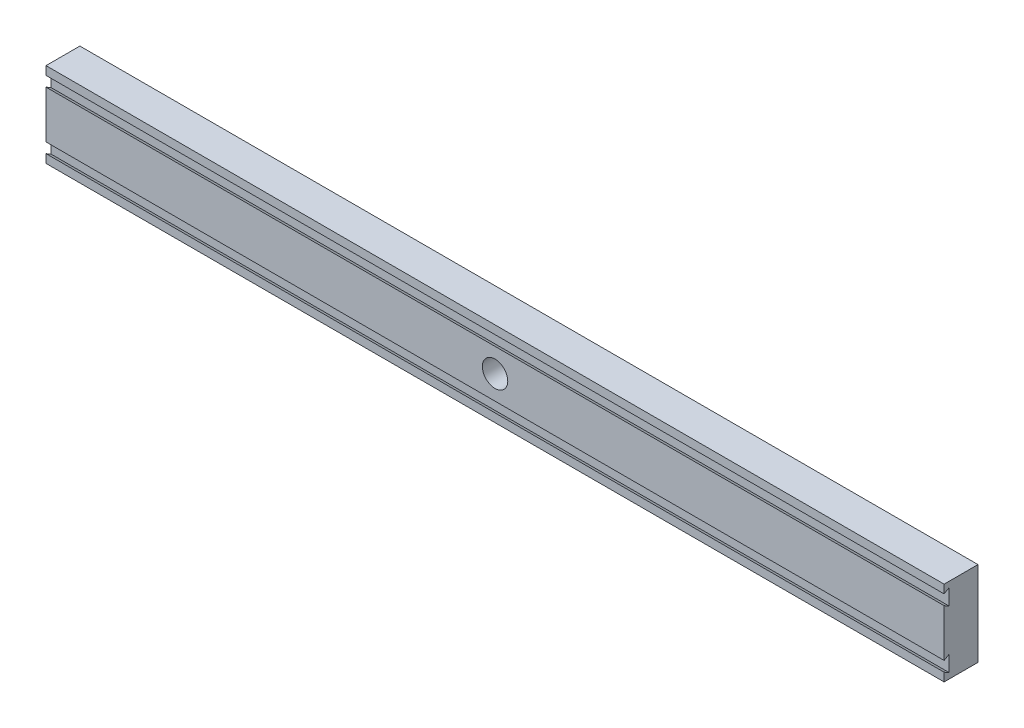
ISO-10303-21;
HEADER;
FILE_DESCRIPTION(('STEP AP214'),'2;1');
FILE_NAME('part.step','',(''),(''),'','','');
FILE_SCHEMA(('AUTOMOTIVE_DESIGN { 1 0 10303 214 1 1 1 1 }'));
ENDSEC;
DATA;
#1=APPLICATION_CONTEXT('core data for automotive mechanical design processes');
#2=APPLICATION_PROTOCOL_DEFINITION('international standard','automotive_design',2000,#1);
#3=PRODUCT_CONTEXT('',#1,'mechanical');
#4=PRODUCT('Part','Part','',(#3));
#5=PRODUCT_RELATED_PRODUCT_CATEGORY('part','',(#4));
#6=PRODUCT_DEFINITION_FORMATION('','',#4);
#7=PRODUCT_DEFINITION_CONTEXT('part definition',#1,'design');
#8=PRODUCT_DEFINITION('design','',#6,#7);
#9=PRODUCT_DEFINITION_SHAPE('','',#8);
#10=(LENGTH_UNIT() NAMED_UNIT(*) SI_UNIT(.MILLI.,.METRE.));
#11=(NAMED_UNIT(*) PLANE_ANGLE_UNIT() SI_UNIT($,.RADIAN.));
#12=(NAMED_UNIT(*) SI_UNIT($,.STERADIAN.) SOLID_ANGLE_UNIT());
#13=UNCERTAINTY_MEASURE_WITH_UNIT(LENGTH_MEASURE(1.E-05),#10,'distance_accuracy_value','');
#14=(GEOMETRIC_REPRESENTATION_CONTEXT(3) GLOBAL_UNCERTAINTY_ASSIGNED_CONTEXT((#13)) GLOBAL_UNIT_ASSIGNED_CONTEXT((#10,
#11,#12)) REPRESENTATION_CONTEXT('',''));
#15=CARTESIAN_POINT('',(0.,0.,0.));
#16=DIRECTION('',(0.,0.,1.));
#17=DIRECTION('',(1.,0.,0.));
#18=AXIS2_PLACEMENT_3D('',#15,#16,#17);
#19=CARTESIAN_POINT('',(66.25,-4.83253175473053,2.48185594676636));
#20=DIRECTION('',(0.,0.866025403784436,-0.500000000000004));
#21=DIRECTION('',(0.,0.500000000000004,0.866025403784436));
#22=AXIS2_PLACEMENT_3D('',#19,#20,#21);
#23=PLANE('',#22);
#24=DIRECTION('',(0.,-0.500000000000005,-0.866025403784436));
#25=VECTOR('',#24,1.);
#26=CARTESIAN_POINT('',(-66.25,-4.83253175473053,2.48185594676636));
#27=LINE('',#26,#25);
#28=CARTESIAN_POINT('',(-66.25,-5.,2.19179243730524));
#29=VERTEX_POINT('',#28);
#30=CARTESIAN_POINT('',(-66.25,-5.43301270189222,1.44179243730524));
#31=VERTEX_POINT('',#30);
#32=EDGE_CURVE('E175',#29,#31,#27,.T.);
#33=ORIENTED_EDGE('',*,*,#32,.F.);
#34=DIRECTION('',(-1.,0.,0.));
#35=VECTOR('',#34,1.);
#36=CARTESIAN_POINT('',(66.25,-5.,2.19179243730524));
#37=LINE('',#36,#35);
#38=CARTESIAN_POINT('',(66.25,-5.,2.19179243730524));
#39=VERTEX_POINT('',#38);
#40=EDGE_CURVE('E12',#39,#29,#37,.T.);
#41=ORIENTED_EDGE('',*,*,#40,.F.);
#42=DIRECTION('',(0.,-0.500000000000005,-0.866025403784436));
#43=VECTOR('',#42,1.);
#44=CARTESIAN_POINT('',(66.25,-4.83253175473053,2.48185594676636));
#45=LINE('',#44,#43);
#46=CARTESIAN_POINT('',(66.25,-5.43301270189222,1.44179243730524));
#47=VERTEX_POINT('',#46);
#48=EDGE_CURVE('E207',#39,#47,#45,.T.);
#49=ORIENTED_EDGE('',*,*,#48,.T.);
#50=DIRECTION('',(-1.,0.,0.));
#51=VECTOR('',#50,1.);
#52=CARTESIAN_POINT('',(66.25,-5.43301270189222,1.44179243730524));
#53=LINE('',#52,#51);
#54=EDGE_CURVE('E62',#47,#31,#53,.T.);
#55=ORIENTED_EDGE('',*,*,#54,.T.);
#56=EDGE_LOOP('',(#33,#41,#49,#55));
#57=FACE_BOUND('',#56,.T.);
#58=ADVANCED_FACE('F48',(#57),#23,.T.);
#59=CARTESIAN_POINT('',(66.25,0.,2.19179243730524));
#60=DIRECTION('',(0.,0.,1.));
#61=DIRECTION('',(1.,0.,0.));
#62=AXIS2_PLACEMENT_3D('',#59,#60,#61);
#63=PLANE('',#62);
#64=DIRECTION('',(0.,1.,0.));
#65=VECTOR('',#64,1.);
#66=CARTESIAN_POINT('',(-66.25,0.,2.19179243730524));
#67=LINE('',#66,#65);
#68=CARTESIAN_POINT('',(-66.25,-6.25,2.19179243730524));
#69=VERTEX_POINT('',#68);
#70=EDGE_CURVE('E172',#69,#29,#67,.T.);
#71=ORIENTED_EDGE('',*,*,#70,.F.);
#72=DIRECTION('',(-1.,0.,0.));
#73=VECTOR('',#72,1.);
#74=CARTESIAN_POINT('',(66.25,-6.25,2.19179243730524));
#75=LINE('',#74,#73);
#76=CARTESIAN_POINT('',(66.25,-6.25,2.19179243730524));
#77=VERTEX_POINT('',#76);
#78=EDGE_CURVE('E60',#77,#69,#75,.T.);
#79=ORIENTED_EDGE('',*,*,#78,.F.);
#80=DIRECTION('',(0.,1.,0.));
#81=VECTOR('',#80,1.);
#82=CARTESIAN_POINT('',(66.25,0.,2.19179243730524));
#83=LINE('',#82,#81);
#84=EDGE_CURVE('E165',#77,#39,#83,.T.);
#85=ORIENTED_EDGE('',*,*,#84,.T.);
#86=ORIENTED_EDGE('',*,*,#40,.T.);
#87=EDGE_LOOP('',(#71,#79,#85,#86));
#88=FACE_BOUND('',#87,.T.);
#89=ADVANCED_FACE('F248',(#88),#63,.T.);
#90=CARTESIAN_POINT('',(66.25,-6.25,-0.308207562694763));
#91=DIRECTION('',(0.,1.,0.));
#92=DIRECTION('',(0.,0.,1.));
#93=AXIS2_PLACEMENT_3D('',#90,#91,#92);
#94=PLANE('',#93);
#95=DIRECTION('',(0.,0.,-1.));
#96=VECTOR('',#95,1.);
#97=CARTESIAN_POINT('',(-66.25,-6.25,-0.308207562694763));
#98=LINE('',#97,#96);
#99=CARTESIAN_POINT('',(-66.25,-6.25,-2.80820756269476));
#100=VERTEX_POINT('',#99);
#101=EDGE_CURVE('E178',#69,#100,#98,.T.);
#102=ORIENTED_EDGE('',*,*,#101,.T.);
#103=DIRECTION('',(-1.,0.,0.));
#104=VECTOR('',#103,1.);
#105=CARTESIAN_POINT('',(66.25,-6.25,-2.80820756269476));
#106=LINE('',#105,#104);
#107=CARTESIAN_POINT('',(66.25,-6.25,-2.80820756269476));
#108=VERTEX_POINT('',#107);
#109=EDGE_CURVE('E234',#108,#100,#106,.T.);
#110=ORIENTED_EDGE('',*,*,#109,.F.);
#111=DIRECTION('',(0.,0.,-1.));
#112=VECTOR('',#111,1.);
#113=CARTESIAN_POINT('',(66.25,-6.25,-0.308207562694763));
#114=LINE('',#113,#112);
#115=EDGE_CURVE('E245',#77,#108,#114,.T.);
#116=ORIENTED_EDGE('',*,*,#115,.F.);
#117=ORIENTED_EDGE('',*,*,#78,.T.);
#118=EDGE_LOOP('',(#102,#110,#116,#117));
#119=FACE_BOUND('',#118,.T.);
#120=ADVANCED_FACE('F238',(#119),#94,.F.);
#121=CARTESIAN_POINT('',(66.25,0.,-2.80820756269476));
#122=DIRECTION('',(0.,0.,1.));
#123=DIRECTION('',(1.,0.,0.));
#124=AXIS2_PLACEMENT_3D('',#121,#122,#123);
#125=PLANE('',#124);
#126=CARTESIAN_POINT('',(0.,0.,-2.80820756269476));
#127=DIRECTION('',(0.,0.,1.));
#128=DIRECTION('',(1.,0.,0.));
#129=AXIS2_PLACEMENT_3D('',#126,#127,#128);
#130=CIRCLE('',#129,1.875);
#131=CARTESIAN_POINT('',(1.87499999999999,0.,-2.80820756269476));
#132=VERTEX_POINT('',#131);
#133=EDGE_CURVE('E177',#132,#132,#130,.T.);
#134=ORIENTED_EDGE('',*,*,#133,.T.);
#135=EDGE_LOOP('',(#134));
#136=FACE_BOUND('',#135,.T.);
#137=DIRECTION('',(0.,1.,0.));
#138=VECTOR('',#137,1.);
#139=CARTESIAN_POINT('',(-66.25,0.,-2.80820756269476));
#140=LINE('',#139,#138);
#141=CARTESIAN_POINT('',(-66.25,6.25,-2.80820756269476));
#142=VERTEX_POINT('',#141);
#143=EDGE_CURVE('E184',#100,#142,#140,.T.);
#144=ORIENTED_EDGE('',*,*,#143,.T.);
#145=DIRECTION('',(-1.,0.,0.));
#146=VECTOR('',#145,1.);
#147=CARTESIAN_POINT('',(66.25,6.25,-2.80820756269476));
#148=LINE('',#147,#146);
#149=CARTESIAN_POINT('',(66.25,6.25,-2.80820756269476));
#150=VERTEX_POINT('',#149);
#151=EDGE_CURVE('E227',#150,#142,#148,.T.);
#152=ORIENTED_EDGE('',*,*,#151,.F.);
#153=DIRECTION('',(0.,1.,0.));
#154=VECTOR('',#153,1.);
#155=CARTESIAN_POINT('',(66.25,0.,-2.80820756269476));
#156=LINE('',#155,#154);
#157=EDGE_CURVE('E299',#108,#150,#156,.T.);
#158=ORIENTED_EDGE('',*,*,#157,.F.);
#159=ORIENTED_EDGE('',*,*,#109,.T.);
#160=EDGE_LOOP('',(#144,#152,#158,#159));
#161=FACE_BOUND('',#160,.T.);
#162=ADVANCED_FACE('F269',(#136,#161),#125,.F.);
#163=CARTESIAN_POINT('',(66.25,6.25,-0.308207562694763));
#164=DIRECTION('',(0.,1.,0.));
#165=DIRECTION('',(0.,0.,1.));
#166=AXIS2_PLACEMENT_3D('',#163,#164,#165);
#167=PLANE('',#166);
#168=DIRECTION('',(0.,0.,-1.));
#169=VECTOR('',#168,1.);
#170=CARTESIAN_POINT('',(-66.25,6.25,-0.308207562694763));
#171=LINE('',#170,#169);
#172=CARTESIAN_POINT('',(-66.25,6.25,2.19179243730524));
#173=VERTEX_POINT('',#172);
#174=EDGE_CURVE('E186',#173,#142,#171,.T.);
#175=ORIENTED_EDGE('',*,*,#174,.F.);
#176=DIRECTION('',(-1.,0.,0.));
#177=VECTOR('',#176,1.);
#178=CARTESIAN_POINT('',(66.25,6.25,2.19179243730524));
#179=LINE('',#178,#177);
#180=CARTESIAN_POINT('',(66.25,6.25,2.19179243730524));
#181=VERTEX_POINT('',#180);
#182=EDGE_CURVE('E230',#181,#173,#179,.T.);
#183=ORIENTED_EDGE('',*,*,#182,.F.);
#184=DIRECTION('',(0.,0.,-1.));
#185=VECTOR('',#184,1.);
#186=CARTESIAN_POINT('',(66.25,6.25,-0.308207562694763));
#187=LINE('',#186,#185);
#188=EDGE_CURVE('E305',#181,#150,#187,.T.);
#189=ORIENTED_EDGE('',*,*,#188,.T.);
#190=ORIENTED_EDGE('',*,*,#151,.T.);
#191=EDGE_LOOP('',(#175,#183,#189,#190));
#192=FACE_BOUND('',#191,.T.);
#193=ADVANCED_FACE('F273',(#192),#167,.T.);
#194=CARTESIAN_POINT('',(-66.25,5.,2.19179243730524));
#195=VERTEX_POINT('',#194);
#196=EDGE_CURVE('E182',#195,#173,#67,.T.);
#197=ORIENTED_EDGE('',*,*,#196,.F.);
#198=DIRECTION('',(-1.,0.,0.));
#199=VECTOR('',#198,1.);
#200=CARTESIAN_POINT('',(66.25,5.,2.19179243730524));
#201=LINE('',#200,#199);
#202=CARTESIAN_POINT('',(66.25,5.,2.19179243730524));
#203=VERTEX_POINT('',#202);
#204=EDGE_CURVE('E221',#203,#195,#201,.T.);
#205=ORIENTED_EDGE('',*,*,#204,.F.);
#206=EDGE_CURVE('E161',#203,#181,#83,.T.);
#207=ORIENTED_EDGE('',*,*,#206,.T.);
#208=ORIENTED_EDGE('',*,*,#182,.T.);
#209=EDGE_LOOP('',(#197,#205,#207,#208));
#210=FACE_BOUND('',#209,.T.);
#211=ADVANCED_FACE('F266',(#210),#63,.T.);
#212=CARTESIAN_POINT('',(66.25,4.83253175473053,2.48185594676636));
#213=DIRECTION('',(0.,0.866025403784436,0.500000000000004));
#214=DIRECTION('',(0.,-0.500000000000004,0.866025403784436));
#215=AXIS2_PLACEMENT_3D('',#212,#213,#214);
#216=PLANE('',#215);
#217=DIRECTION('',(0.,0.500000000000005,-0.866025403784436));
#218=VECTOR('',#217,1.);
#219=CARTESIAN_POINT('',(-66.25,4.83253175473053,2.48185594676636));
#220=LINE('',#219,#218);
#221=CARTESIAN_POINT('',(-66.25,5.43301270189223,1.44179243730524));
#222=VERTEX_POINT('',#221);
#223=EDGE_CURVE('E195',#195,#222,#220,.T.);
#224=ORIENTED_EDGE('',*,*,#223,.T.);
#225=DIRECTION('',(-1.,0.,0.));
#226=VECTOR('',#225,1.);
#227=CARTESIAN_POINT('',(66.25,5.43301270189223,1.44179243730524));
#228=LINE('',#227,#226);
#229=CARTESIAN_POINT('',(66.25,5.43301270189223,1.44179243730524));
#230=VERTEX_POINT('',#229);
#231=EDGE_CURVE('E219',#230,#222,#228,.T.);
#232=ORIENTED_EDGE('',*,*,#231,.F.);
#233=DIRECTION('',(0.,0.500000000000005,-0.866025403784436));
#234=VECTOR('',#233,1.);
#235=CARTESIAN_POINT('',(66.25,4.83253175473053,2.48185594676636));
#236=LINE('',#235,#234);
#237=EDGE_CURVE('E308',#203,#230,#236,.T.);
#238=ORIENTED_EDGE('',*,*,#237,.F.);
#239=ORIENTED_EDGE('',*,*,#204,.T.);
#240=EDGE_LOOP('',(#224,#232,#238,#239));
#241=FACE_BOUND('',#240,.T.);
#242=ADVANCED_FACE('F272',(#241),#216,.F.);
#243=CARTESIAN_POINT('',(66.25,0.,1.44179243730524));
#244=DIRECTION('',(0.,0.,-1.));
#245=DIRECTION('',(-1.,0.,0.));
#246=AXIS2_PLACEMENT_3D('',#243,#244,#245);
#247=PLANE('',#246);
#248=DIRECTION('',(0.,-1.,0.));
#249=VECTOR('',#248,1.);
#250=CARTESIAN_POINT('',(-66.25,0.,1.44179243730524));
#251=LINE('',#250,#249);
#252=CARTESIAN_POINT('',(-66.25,3.06698729810778,1.44179243730524));
#253=VERTEX_POINT('',#252);
#254=EDGE_CURVE('E193',#222,#253,#251,.T.);
#255=ORIENTED_EDGE('',*,*,#254,.T.);
#256=DIRECTION('',(-1.,0.,0.));
#257=VECTOR('',#256,1.);
#258=CARTESIAN_POINT('',(66.25,3.06698729810778,1.44179243730524));
#259=LINE('',#258,#257);
#260=CARTESIAN_POINT('',(66.25,3.06698729810778,1.44179243730524));
#261=VERTEX_POINT('',#260);
#262=EDGE_CURVE('E216',#261,#253,#259,.T.);
#263=ORIENTED_EDGE('',*,*,#262,.F.);
#264=DIRECTION('',(0.,-1.,0.));
#265=VECTOR('',#264,1.);
#266=CARTESIAN_POINT('',(66.25,0.,1.44179243730524));
#267=LINE('',#266,#265);
#268=EDGE_CURVE('E306',#230,#261,#267,.T.);
#269=ORIENTED_EDGE('',*,*,#268,.F.);
#270=ORIENTED_EDGE('',*,*,#231,.T.);
#271=EDGE_LOOP('',(#255,#263,#269,#270));
#272=FACE_BOUND('',#271,.T.);
#273=ADVANCED_FACE('F285',(#272),#247,.F.);
#274=CARTESIAN_POINT('',(66.25,1.54246824526943,-1.19875201931753));
#275=DIRECTION('',(0.,-0.866025403784437,0.500000000000003));
#276=DIRECTION('',(0.,-0.500000000000003,-0.866025403784437));
#277=AXIS2_PLACEMENT_3D('',#274,#275,#276);
#278=PLANE('',#277);
#279=DIRECTION('',(0.,0.500000000000003,0.866025403784437));
#280=VECTOR('',#279,1.);
#281=CARTESIAN_POINT('',(-66.25,1.54246824526943,-1.19875201931753));
#282=LINE('',#281,#280);
#283=CARTESIAN_POINT('',(-66.25,3.5,2.19179243730524));
#284=VERTEX_POINT('',#283);
#285=EDGE_CURVE('E196',#253,#284,#282,.T.);
#286=ORIENTED_EDGE('',*,*,#285,.T.);
#287=DIRECTION('',(-1.,0.,0.));
#288=VECTOR('',#287,1.);
#289=CARTESIAN_POINT('',(66.25,3.5,2.19179243730524));
#290=LINE('',#289,#288);
#291=CARTESIAN_POINT('',(66.25,3.5,2.19179243730524));
#292=VERTEX_POINT('',#291);
#293=EDGE_CURVE('E149',#292,#284,#290,.T.);
#294=ORIENTED_EDGE('',*,*,#293,.F.);
#295=DIRECTION('',(0.,0.500000000000003,0.866025403784437));
#296=VECTOR('',#295,1.);
#297=CARTESIAN_POINT('',(66.25,1.54246824526943,-1.19875201931753));
#298=LINE('',#297,#296);
#299=EDGE_CURVE('E160',#261,#292,#298,.T.);
#300=ORIENTED_EDGE('',*,*,#299,.F.);
#301=ORIENTED_EDGE('',*,*,#262,.T.);
#302=EDGE_LOOP('',(#286,#294,#300,#301));
#303=FACE_BOUND('',#302,.T.);
#304=ADVANCED_FACE('F280',(#303),#278,.F.);
#305=CARTESIAN_POINT('',(0.,0.,2.19179243730524));
#306=DIRECTION('',(0.,0.,1.));
#307=DIRECTION('',(1.,0.,0.));
#308=AXIS2_PLACEMENT_3D('',#305,#306,#307);
#309=CIRCLE('',#308,1.875);
#310=CARTESIAN_POINT('',(1.87499999999999,0.,2.19179243730524));
#311=VERTEX_POINT('',#310);
#312=EDGE_CURVE('E287',#311,#311,#309,.T.);
#313=ORIENTED_EDGE('',*,*,#312,.F.);
#314=EDGE_LOOP('',(#313));
#315=FACE_BOUND('',#314,.T.);
#316=CARTESIAN_POINT('',(-66.25,-3.5,2.19179243730524));
#317=VERTEX_POINT('',#316);
#318=EDGE_CURVE('E145',#317,#284,#67,.T.);
#319=ORIENTED_EDGE('',*,*,#318,.F.);
#320=DIRECTION('',(-1.,0.,0.));
#321=VECTOR('',#320,1.);
#322=CARTESIAN_POINT('',(66.25,-3.5,2.19179243730524));
#323=LINE('',#322,#321);
#324=CARTESIAN_POINT('',(66.25,-3.5,2.19179243730524));
#325=VERTEX_POINT('',#324);
#326=EDGE_CURVE('E136',#325,#317,#323,.T.);
#327=ORIENTED_EDGE('',*,*,#326,.F.);
#328=EDGE_CURVE('E142',#325,#292,#83,.T.);
#329=ORIENTED_EDGE('',*,*,#328,.T.);
#330=ORIENTED_EDGE('',*,*,#293,.T.);
#331=EDGE_LOOP('',(#319,#327,#329,#330));
#332=FACE_BOUND('',#331,.T.);
#333=ADVANCED_FACE('F143',(#315,#332),#63,.T.);
#334=CARTESIAN_POINT('',(66.25,-1.54246824526943,-1.19875201931753));
#335=DIRECTION('',(0.,-0.866025403784437,-0.500000000000003));
#336=DIRECTION('',(0.,0.500000000000003,-0.866025403784437));
#337=AXIS2_PLACEMENT_3D('',#334,#335,#336);
#338=PLANE('',#337);
#339=DIRECTION('',(0.,-0.500000000000003,0.866025403784437));
#340=VECTOR('',#339,1.);
#341=CARTESIAN_POINT('',(-66.25,-1.54246824526943,-1.19875201931753));
#342=LINE('',#341,#340);
#343=CARTESIAN_POINT('',(-66.25,-3.06698729810778,1.44179243730524));
#344=VERTEX_POINT('',#343);
#345=EDGE_CURVE('E205',#344,#317,#342,.T.);
#346=ORIENTED_EDGE('',*,*,#345,.F.);
#347=DIRECTION('',(-1.,0.,0.));
#348=VECTOR('',#347,1.);
#349=CARTESIAN_POINT('',(66.25,-3.06698729810778,1.44179243730524));
#350=LINE('',#349,#348);
#351=CARTESIAN_POINT('',(66.25,-3.06698729810778,1.44179243730524));
#352=VERTEX_POINT('',#351);
#353=EDGE_CURVE('E105',#352,#344,#350,.T.);
#354=ORIENTED_EDGE('',*,*,#353,.F.);
#355=DIRECTION('',(0.,-0.500000000000003,0.866025403784437));
#356=VECTOR('',#355,1.);
#357=CARTESIAN_POINT('',(66.25,-1.54246824526943,-1.19875201931753));
#358=LINE('',#357,#356);
#359=EDGE_CURVE('E154',#352,#325,#358,.T.);
#360=ORIENTED_EDGE('',*,*,#359,.T.);
#361=ORIENTED_EDGE('',*,*,#326,.T.);
#362=EDGE_LOOP('',(#346,#354,#360,#361));
#363=FACE_BOUND('',#362,.T.);
#364=ADVANCED_FACE('F162',(#363),#338,.T.);
#365=CARTESIAN_POINT('',(66.25,0.,1.44179243730524));
#366=DIRECTION('',(0.,0.,1.));
#367=DIRECTION('',(1.,0.,0.));
#368=AXIS2_PLACEMENT_3D('',#365,#366,#367);
#369=PLANE('',#368);
#370=DIRECTION('',(0.,1.,0.));
#371=VECTOR('',#370,1.);
#372=CARTESIAN_POINT('',(-66.25,0.,1.44179243730524));
#373=LINE('',#372,#371);
#374=EDGE_CURVE('E202',#31,#344,#373,.T.);
#375=ORIENTED_EDGE('',*,*,#374,.F.);
#376=ORIENTED_EDGE('',*,*,#54,.F.);
#377=DIRECTION('',(0.,1.,0.));
#378=VECTOR('',#377,1.);
#379=CARTESIAN_POINT('',(66.25,0.,1.44179243730524));
#380=LINE('',#379,#378);
#381=EDGE_CURVE('E164',#47,#352,#380,.T.);
#382=ORIENTED_EDGE('',*,*,#381,.T.);
#383=ORIENTED_EDGE('',*,*,#353,.T.);
#384=EDGE_LOOP('',(#375,#376,#382,#383));
#385=FACE_BOUND('',#384,.T.);
#386=ADVANCED_FACE('F253',(#385),#369,.T.);
#387=CARTESIAN_POINT('',(66.25,0.,-0.308207562694763));
#388=DIRECTION('',(1.,0.,0.));
#389=DIRECTION('',(0.,0.,-1.));
#390=AXIS2_PLACEMENT_3D('',#387,#388,#389);
#391=PLANE('',#390);
#392=ORIENTED_EDGE('',*,*,#48,.F.);
#393=ORIENTED_EDGE('',*,*,#84,.F.);
#394=ORIENTED_EDGE('',*,*,#115,.T.);
#395=ORIENTED_EDGE('',*,*,#157,.T.);
#396=ORIENTED_EDGE('',*,*,#188,.F.);
#397=ORIENTED_EDGE('',*,*,#206,.F.);
#398=ORIENTED_EDGE('',*,*,#237,.T.);
#399=ORIENTED_EDGE('',*,*,#268,.T.);
#400=ORIENTED_EDGE('',*,*,#299,.T.);
#401=ORIENTED_EDGE('',*,*,#328,.F.);
#402=ORIENTED_EDGE('',*,*,#359,.F.);
#403=ORIENTED_EDGE('',*,*,#381,.F.);
#404=EDGE_LOOP('',(#392,#393,#394,#395,#396,#397,#398,#399,#400,#401,#402,#403));
#405=FACE_BOUND('',#404,.T.);
#406=ADVANCED_FACE('F153',(#405),#391,.T.);
#407=CARTESIAN_POINT('',(-66.25,0.,-0.308207562694763));
#408=DIRECTION('',(1.,0.,0.));
#409=DIRECTION('',(0.,0.,-1.));
#410=AXIS2_PLACEMENT_3D('',#407,#408,#409);
#411=PLANE('',#410);
#412=ORIENTED_EDGE('',*,*,#32,.T.);
#413=ORIENTED_EDGE('',*,*,#374,.T.);
#414=ORIENTED_EDGE('',*,*,#345,.T.);
#415=ORIENTED_EDGE('',*,*,#318,.T.);
#416=ORIENTED_EDGE('',*,*,#285,.F.);
#417=ORIENTED_EDGE('',*,*,#254,.F.);
#418=ORIENTED_EDGE('',*,*,#223,.F.);
#419=ORIENTED_EDGE('',*,*,#196,.T.);
#420=ORIENTED_EDGE('',*,*,#174,.T.);
#421=ORIENTED_EDGE('',*,*,#143,.F.);
#422=ORIENTED_EDGE('',*,*,#101,.F.);
#423=ORIENTED_EDGE('',*,*,#70,.T.);
#424=EDGE_LOOP('',(#412,#413,#414,#415,#416,#417,#418,#419,#420,#421,#422,#423));
#425=FACE_BOUND('',#424,.T.);
#426=ADVANCED_FACE('F246',(#425),#411,.F.);
#427=CARTESIAN_POINT('',(0.,0.,-2.80820756269476));
#428=DIRECTION('',(0.,0.,1.));
#429=DIRECTION('',(1.,0.,0.));
#430=AXIS2_PLACEMENT_3D('',#427,#428,#429);
#431=CYLINDRICAL_SURFACE('',#430,1.875);
#432=ORIENTED_EDGE('',*,*,#133,.F.);
#433=EDGE_LOOP('',(#432));
#434=FACE_BOUND('',#433,.T.);
#435=ORIENTED_EDGE('',*,*,#312,.T.);
#436=EDGE_LOOP('',(#435));
#437=FACE_BOUND('',#436,.T.);
#438=ADVANCED_FACE('F382',(#434,#437),#431,.F.);
#439=CLOSED_SHELL('',(#58,#89,#120,#162,#193,#211,#242,#273,#304,#333,#364,#386,#406,#426,#438));
#440=MANIFOLD_SOLID_BREP('B2',#439);
#441=ADVANCED_BREP_SHAPE_REPRESENTATION('',(#18,#440),#14);
#442=SHAPE_DEFINITION_REPRESENTATION(#9,#441);
ENDSEC;
END-ISO-10303-21;
